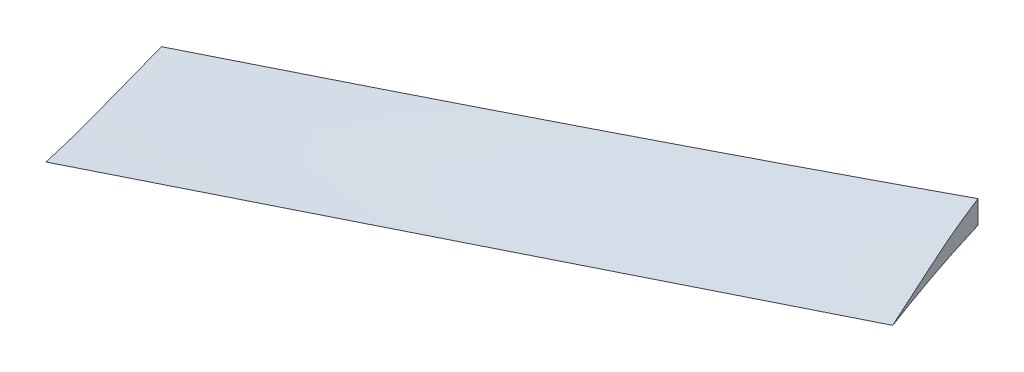
ISO-10303-21;
HEADER;
FILE_DESCRIPTION(('STEP AP214'),'2;1');
FILE_NAME('part.step','',(''),(''),'','','');
FILE_SCHEMA(('AUTOMOTIVE_DESIGN { 1 0 10303 214 1 1 1 1 }'));
ENDSEC;
DATA;
#1=APPLICATION_CONTEXT('core data for automotive mechanical design processes');
#2=APPLICATION_PROTOCOL_DEFINITION('international standard','automotive_design',2000,#1);
#3=PRODUCT_CONTEXT('',#1,'mechanical');
#4=PRODUCT('Part','Part','',(#3));
#5=PRODUCT_RELATED_PRODUCT_CATEGORY('part','',(#4));
#6=PRODUCT_DEFINITION_FORMATION('','',#4);
#7=PRODUCT_DEFINITION_CONTEXT('part definition',#1,'design');
#8=PRODUCT_DEFINITION('design','',#6,#7);
#9=PRODUCT_DEFINITION_SHAPE('','',#8);
#10=(LENGTH_UNIT() NAMED_UNIT(*) SI_UNIT(.MILLI.,.METRE.));
#11=(NAMED_UNIT(*) PLANE_ANGLE_UNIT() SI_UNIT($,.RADIAN.));
#12=(NAMED_UNIT(*) SI_UNIT($,.STERADIAN.) SOLID_ANGLE_UNIT());
#13=UNCERTAINTY_MEASURE_WITH_UNIT(LENGTH_MEASURE(1.E-05),#10,'distance_accuracy_value','');
#14=(GEOMETRIC_REPRESENTATION_CONTEXT(3) GLOBAL_UNCERTAINTY_ASSIGNED_CONTEXT((#13)) GLOBAL_UNIT_ASSIGNED_CONTEXT((#10,
#11,#12)) REPRESENTATION_CONTEXT('',''));
#15=CARTESIAN_POINT('',(0.,0.,0.));
#16=DIRECTION('',(0.,0.,1.));
#17=DIRECTION('',(1.,0.,0.));
#18=AXIS2_PLACEMENT_3D('',#15,#16,#17);
#19=CARTESIAN_POINT('',(374.396,61.9718742803303,500.462069913375));
#20=DIRECTION('',(1.,0.,0.));
#21=DIRECTION('',(0.,0.,1.));
#22=AXIS2_PLACEMENT_3D('',#19,#20,#21);
#23=PLANE('',#22);
#24=DIRECTION('',(0.,1.,0.));
#25=VECTOR('',#24,1.);
#26=CARTESIAN_POINT('',(374.396,61.9718742803303,762.947336932218));
#27=LINE('',#26,#25);
#28=CARTESIAN_POINT('',(374.396,-2.40388597600074,762.947336932218));
#29=VERTEX_POINT('',#28);
#30=CARTESIAN_POINT('',(374.396,1.23163319584544,762.94733693398));
#31=VERTEX_POINT('',#30);
#32=EDGE_CURVE('E85',#29,#31,#27,.T.);
#33=ORIENTED_EDGE('',*,*,#32,.T.);
#34=CARTESIAN_POINT('',(374.396,-9.34014397229245,776.396489798407));
#35=CARTESIAN_POINT('',(374.396,-8.40175484291137,775.264229702307));
#36=CARTESIAN_POINT('',(374.396,-6.09606028875458,772.482179211869));
#37=CARTESIAN_POINT('',(374.396,-2.17943506157781,768.02376491039));
#38=CARTESIAN_POINT('',(374.396,1.84859835881143,762.218322929233));
#39=CARTESIAN_POINT('',(374.396,5.6003449114185,755.243229685749));
#40=CARTESIAN_POINT('',(374.396,9.33547168888237,746.912760700583));
#41=CARTESIAN_POINT('',(374.396,13.2386089066728,737.018252871707));
#42=CARTESIAN_POINT('',(374.396,17.3161821827427,725.47867829808));
#43=CARTESIAN_POINT('',(374.396,21.5115819527909,712.428375502739));
#44=CARTESIAN_POINT('',(374.396,25.7421233345226,698.167711363482));
#45=CARTESIAN_POINT('',(374.396,29.9240395368495,683.062552056113));
#46=CARTESIAN_POINT('',(374.396,33.9819197101395,667.44471749513));
#47=CARTESIAN_POINT('',(374.396,37.8587807196238,651.563094478592));
#48=CARTESIAN_POINT('',(374.396,41.5075682698668,635.571677798897));
#49=CARTESIAN_POINT('',(374.396,44.8962045562709,619.54213496093));
#50=CARTESIAN_POINT('',(374.396,48.0062629675248,603.480438344816));
#51=CARTESIAN_POINT('',(374.396,50.8384531277133,587.348007896632));
#52=CARTESIAN_POINT('',(374.396,53.4037267628393,571.079262558276));
#53=CARTESIAN_POINT('',(374.396,55.7297505453312,554.597347914761));
#54=CARTESIAN_POINT('',(374.396,57.8518789503547,537.831743695071));
#55=CARTESIAN_POINT('',(374.396,59.8203943308259,520.741731840539));
#56=CARTESIAN_POINT('',(374.396,61.6856473828784,503.340217598354));
#57=CARTESIAN_POINT('',(374.396,63.4899259876005,485.710728793018));
#58=CARTESIAN_POINT('',(374.396,65.2498913593578,468.011203683683));
#59=CARTESIAN_POINT('',(374.396,66.9517721977821,450.459510763352));
#60=CARTESIAN_POINT('',(374.396,68.5378660271085,433.311455418955));
#61=CARTESIAN_POINT('',(374.396,69.9289151057664,416.841536857024));
#62=CARTESIAN_POINT('',(374.396,71.0327683067303,401.296477173787));
#63=CARTESIAN_POINT('',(374.396,71.7296272901284,386.808729152987));
#64=CARTESIAN_POINT('',(374.396,71.8938086245965,373.351309186629));
#65=CARTESIAN_POINT('',(374.396,71.4602978508936,360.783321416241));
#66=CARTESIAN_POINT('',(374.396,70.4184719929158,348.941977505793));
#67=CARTESIAN_POINT('',(374.396,68.7634225939546,337.701052477739));
#68=CARTESIAN_POINT('',(374.396,66.4985267442778,326.980618986022));
#69=CARTESIAN_POINT('',(374.396,63.6364757752088,316.739864214787));
#70=CARTESIAN_POINT('',(374.396,60.2063348553058,306.973125092115));
#71=CARTESIAN_POINT('',(374.396,56.2453758331957,297.713837697883));
#72=CARTESIAN_POINT('',(374.396,51.8366046907402,289.029736201877));
#73=CARTESIAN_POINT('',(374.396,47.1113365011114,281.025296442116));
#74=CARTESIAN_POINT('',(374.396,42.2563698958084,273.817045833498));
#75=CARTESIAN_POINT('',(374.396,37.4675939077021,267.502444449423));
#76=CARTESIAN_POINT('',(374.396,32.9120113189413,262.11107633905));
#77=CARTESIAN_POINT('',(374.396,28.6710997916291,257.609906739654));
#78=CARTESIAN_POINT('',(374.396,24.7595382100328,253.911291370847));
#79=CARTESIAN_POINT('',(374.396,21.1572388306981,250.902182399076));
#80=CARTESIAN_POINT('',(374.396,17.8395196406259,248.463647547404));
#81=CARTESIAN_POINT('',(374.396,14.7801988216139,246.49190181607));
#82=CARTESIAN_POINT('',(374.396,11.9506148597635,244.907396988431));
#83=CARTESIAN_POINT('',(374.396,9.32321496425856,243.64953423366));
#84=CARTESIAN_POINT('',(374.396,6.87061839463228,242.679778651959));
#85=CARTESIAN_POINT('',(374.396,4.57158692532996,241.966757378294));
#86=CARTESIAN_POINT('',(374.396,2.40963479027394,241.495055010141));
#87=CARTESIAN_POINT('',(374.396,0.894237049815755,241.32398184574));
#88=CARTESIAN_POINT('',(374.396,0.107544091622905,241.302884141123));
#89=CARTESIAN_POINT('',(374.396,0.,241.3));
#90=B_SPLINE_CURVE_WITH_KNOTS('',3,(#34,#35,#36,#37,#38,#39,#40,#41,#42,#43,#44,#45,#46,#47,#48,
#49,#50,#51,#52,#53,#54,#55,#56,#57,#58,#59,#60,#61,#62,#63,#64,#65,#66,#67,#68,#69,#70,#71,#72,
#73,#74,#75,#76,#77,#78,#79,#80,#81,#82,#83,#84,#85,#86,#87,#88,#89),.UNSPECIFIED.,.F.,.F.,(4,1,
1,1,1,1,1,1,1,1,1,1,1,1,1,1,1,1,1,1,1,1,1,1,1,1,1,1,1,1,1,1,1,1,1,1,1,1,1,1,1,1,1,1,1,1,1,1,1,1,
1,1,1,4),(0.,0.00766402095757611,0.0188310913155853,0.0309061878624514,0.044388540676871,
0.0600474083532868,0.0784606788934647,0.0998047207561698,0.123816969987705,0.149890658407643,
0.177317925985823,0.205492409209094,0.233979752311192,0.262509715956203,0.290967606389999,
0.319357501013423,0.347763187640679,0.376320625595132,0.405182950986283,0.434503841432051,
0.464386678217646,0.494832433453987,0.525708038913636,0.556739737234784,0.587525557609377,
0.617604809699268,0.646485108208642,0.67366014348048,0.698815639347954,0.722062593959947,
0.743776305511465,0.764323117717657,0.783977995344401,0.802952239366703,0.821385981311945,
0.839352413735504,0.856858699994966,0.873830573178779,0.890070807540379,0.905268010379337,
0.919095859386137,0.931350851483357,0.942034396352869,0.951307872005367,0.959388407782576,
0.966479389489374,0.972752010348399,0.978344065778329,0.983368996467432,0.987921251922054,
0.992076472154305,0.995898893569495,0.99943936225551,1.),.UNSPECIFIED.);
#91=CARTESIAN_POINT('',(374.396,-9.34014397229244,776.396489798407));
#92=VERTEX_POINT('',#91);
#93=EDGE_CURVE('E77',#92,#31,#90,.T.);
#94=ORIENTED_EDGE('',*,*,#93,.F.);
#95=CARTESIAN_POINT('',(374.396,0.,241.3));
#96=CARTESIAN_POINT('',(374.396,-0.538954659703314,241.297655184968));
#97=CARTESIAN_POINT('',(374.396,-1.7261603333214,241.292490042168));
#98=CARTESIAN_POINT('',(374.396,-3.55475690139812,241.690170496209));
#99=CARTESIAN_POINT('',(374.396,-5.28575044275841,242.787647348631));
#100=CARTESIAN_POINT('',(374.396,-6.47819703634325,244.55910096819));
#101=CARTESIAN_POINT('',(374.396,-7.23439961710996,246.693492664323));
#102=CARTESIAN_POINT('',(374.396,-7.74934951346128,249.131026639712));
#103=CARTESIAN_POINT('',(374.396,-8.1095524567562,251.905250666347));
#104=CARTESIAN_POINT('',(374.396,-8.36536130938982,255.097825264003));
#105=CARTESIAN_POINT('',(374.396,-8.53927775370538,258.834169307143));
#106=CARTESIAN_POINT('',(374.396,-8.6228222097704,263.297687326147));
#107=CARTESIAN_POINT('',(374.396,-8.59845411935391,268.75143324473));
#108=CARTESIAN_POINT('',(374.396,-8.43043441446886,275.5550068996));
#109=CARTESIAN_POINT('',(374.396,-8.06897383873518,284.115477039142));
#110=CARTESIAN_POINT('',(374.396,-7.46729611245012,294.701993416563));
#111=CARTESIAN_POINT('',(374.396,-6.56550935140482,307.23866248115));
#112=CARTESIAN_POINT('',(374.396,-5.26774660320282,321.351176792217));
#113=CARTESIAN_POINT('',(374.396,-3.4986121172012,336.635216144863));
#114=CARTESIAN_POINT('',(374.396,-1.31741885957216,352.842840734093));
#115=CARTESIAN_POINT('',(374.396,1.12162569591117,369.80872672652));
#116=CARTESIAN_POINT('',(374.396,3.70484150758706,387.306924798737));
#117=CARTESIAN_POINT('',(374.396,6.35085572360206,405.053096077913));
#118=CARTESIAN_POINT('',(374.396,8.98235684046696,422.799408725511));
#119=CARTESIAN_POINT('',(374.396,11.5300227909959,440.376908078112));
#120=CARTESIAN_POINT('',(374.396,13.9430010682351,457.707871031536));
#121=CARTESIAN_POINT('',(374.396,16.1729066622707,474.772580756103));
#122=CARTESIAN_POINT('',(374.396,18.1852831627042,491.576454148917));
#123=CARTESIAN_POINT('',(374.396,19.9445194919549,508.13688707812));
#124=CARTESIAN_POINT('',(374.396,21.4228531653779,524.480515326682));
#125=CARTESIAN_POINT('',(374.396,22.6006648317829,540.633952092378));
#126=CARTESIAN_POINT('',(374.396,23.4570220295475,556.625916689834));
#127=CARTESIAN_POINT('',(374.396,23.9811859014682,572.479352868524));
#128=CARTESIAN_POINT('',(374.396,24.1589041565962,588.217968124516));
#129=CARTESIAN_POINT('',(374.396,23.9828437048313,603.859249005849));
#130=CARTESIAN_POINT('',(374.396,23.4456129995817,619.418444987461));
#131=CARTESIAN_POINT('',(374.396,22.5455229148943,634.89794778659));
#132=CARTESIAN_POINT('',(374.396,21.2803649513233,650.289014071176));
#133=CARTESIAN_POINT('',(374.396,19.6554964574737,665.556610194271));
#134=CARTESIAN_POINT('',(374.396,17.6770159172737,680.627419737525));
#135=CARTESIAN_POINT('',(374.396,15.374920464339,695.363311814011));
#136=CARTESIAN_POINT('',(374.396,12.7828970747854,709.538692080346));
#137=CARTESIAN_POINT('',(374.396,9.97075851827043,722.850908635221));
#138=CARTESIAN_POINT('',(374.396,7.01255821457496,734.983994696583));
#139=CARTESIAN_POINT('',(374.396,3.96652793492765,745.710637795198));
#140=CARTESIAN_POINT('',(374.396,0.871097223163982,754.965559992787));
#141=CARTESIAN_POINT('',(374.396,-2.26764612386533,762.812999366146));
#142=CARTESIAN_POINT('',(374.396,-5.55090807095211,769.870558630561));
#143=CARTESIAN_POINT('',(374.396,-8.0522393298167,774.178423342215));
#144=CARTESIAN_POINT('',(374.396,-9.34014397229244,776.396489798407));
#145=B_SPLINE_CURVE_WITH_KNOTS('',3,(#95,#96,#97,#98,#99,#100,#101,#102,#103,#104,#105,#106,
#107,#108,#109,#110,#111,#112,#113,#114,#115,#116,#117,#118,#119,#120,#121,#122,#123,#124,#125,
#126,#127,#128,#129,#130,#131,#132,#133,#134,#135,#136,#137,#138,#139,#140,#141,#142,#143,#144),
.UNSPECIFIED.,.F.,.F.,(4,1,1,1,1,1,1,1,1,1,1,1,1,1,1,1,1,1,1,1,1,1,1,1,1,1,1,1,1,1,1,1,1,1,1,1,
1,1,1,1,1,1,1,1,1,1,1,4),(0.,0.00295699573707231,0.00651365017947627,0.0101253848931793,
0.0139115751929899,0.0180004278100691,0.0225091316382041,0.0275701977614678,0.0333552559313343,
0.0400939348988516,0.0481089397634267,0.0578698759413965,0.0700431416558855,0.0854823200575231,
0.104922628293272,0.128274621706956,0.154506379577485,0.182746709372674,0.212765692945345,
0.244315984766029,0.276878379293871,0.309904596254752,0.342852711105616,0.375404074373811,
0.407445978793529,0.438949076096661,0.469916219615646,0.500387507784893,0.530404994878598,
0.560035323702218,0.589330242489587,0.618350497736926,0.64714111982614,0.675762770521893,
0.704247976592449,0.732632991406434,0.76090944583605,0.789050397380166,0.816945539223071,
0.844377954813452,0.870950736544431,0.89607601673736,0.91908997684288,0.939522087621465,
0.957298390503345,0.972656028240629,0.985920925887869,1.),.UNSPECIFIED.);
#146=EDGE_CURVE('E49',#29,#92,#145,.T.);
#147=ORIENTED_EDGE('',*,*,#146,.F.);
#148=EDGE_LOOP('',(#33,#94,#147));
#149=FACE_BOUND('',#148,.T.);
#150=ADVANCED_FACE('F37',(#149),#23,.T.);
#151=CARTESIAN_POINT('',(266.7,66.8514364736246,396.625549586027));
#152=DIRECTION('',(1.,0.,0.));
#153=DIRECTION('',(0.,0.,1.));
#154=AXIS2_PLACEMENT_3D('',#151,#152,#153);
#155=PLANE('',#154);
#156=CARTESIAN_POINT('',(266.7,0.,-2.22044604925031E-13));
#157=CARTESIAN_POINT('',(266.7,-0.519005663251776,0.017452032873233));
#158=CARTESIAN_POINT('',(266.7,-1.83376590691603,0.0616620302726911));
#159=CARTESIAN_POINT('',(266.7,-4.39681155696864,0.570189514822628));
#160=CARTESIAN_POINT('',(266.7,-10.6163864618155,2.53612961981586));
#161=CARTESIAN_POINT('',(266.7,-20.5501355548249,7.99821180015903));
#162=CARTESIAN_POINT('',(266.7,-34.1849518234197,16.113653600363));
#163=CARTESIAN_POINT('',(266.7,-48.9001609581499,25.7512677237677));
#164=CARTESIAN_POINT('',(266.7,-62.9387722637982,36.9320129206593));
#165=CARTESIAN_POINT('',(266.7,-75.9185649305428,49.3363693895977));
#166=CARTESIAN_POINT('',(266.7,-85.6249870081858,65.2269065389885));
#167=CARTESIAN_POINT('',(266.7,-91.7173571850375,84.4527650461813));
#168=CARTESIAN_POINT('',(266.7,-96.1515107337435,106.852134497504));
#169=CARTESIAN_POINT('',(266.7,-98.572249175019,132.510932075947));
#170=CARTESIAN_POINT('',(266.7,-99.0923828679342,161.194365788217));
#171=CARTESIAN_POINT('',(266.7,-97.704243710744,192.761343292207));
#172=CARTESIAN_POINT('',(266.7,-94.5118392960195,227.038217577403));
#173=CARTESIAN_POINT('',(266.7,-89.6638281224946,263.834756502374));
#174=CARTESIAN_POINT('',(266.7,-83.3884450275636,302.921473177158));
#175=CARTESIAN_POINT('',(266.7,-75.9777868038037,344.017776041357));
#176=CARTESIAN_POINT('',(266.7,-67.7807073824362,386.776799789028));
#177=CARTESIAN_POINT('',(266.7,-59.2023239554158,430.774614869882));
#178=CARTESIAN_POINT('',(266.7,-50.6638051201837,475.496263681297));
#179=CARTESIAN_POINT('',(266.7,-42.6036124709931,520.335279967129));
#180=CARTESIAN_POINT('',(266.7,-35.422796347196,564.588870456406));
#181=CARTESIAN_POINT('',(266.7,-29.4733080838114,607.47093439981));
#182=CARTESIAN_POINT('',(266.7,-25.0144733830484,648.127538759038));
#183=CARTESIAN_POINT('',(266.7,-22.1862417822715,685.667615873134));
#184=CARTESIAN_POINT('',(266.7,-21.0047614095253,719.196759596281));
#185=CARTESIAN_POINT('',(266.7,-21.2786363122994,747.830287498173));
#186=CARTESIAN_POINT('',(266.7,-22.8547119223245,770.688405742853));
#187=CARTESIAN_POINT('',(266.7,-25.0735156397646,787.091395164078));
#188=CARTESIAN_POINT('',(266.7,-26.8193281874778,796.842303094878));
#189=CARTESIAN_POINT('',(266.7,-27.7751407453036,801.097715574997));
#190=CARTESIAN_POINT('',(266.7,-28.0117320332951,802.151053398607));
#191=B_SPLINE_CURVE_WITH_KNOTS('',3,(#156,#157,#158,#159,#160,#161,#162,#163,#164,#165,#166,
#167,#168,#169,#170,#171,#172,#173,#174,#175,#176,#177,#178,#179,#180,#181,#182,#183,#184,#185,
#186,#187,#188,#189,#190),.UNSPECIFIED.,.F.,.F.,(4,1,1,1,1,1,1,1,1,1,1,1,1,1,1,1,1,1,1,1,1,1,1,
1,1,1,1,1,1,1,1,1,4),(0.,0.00182090933464196,0.00461278049497482,0.00913453013845994,
0.0246759391487866,0.0441527676320363,0.064937102928184,0.0863209881898911,0.107137618403306,
0.127599776801144,0.150892792929449,0.177565203441126,0.207667777211646,0.241222088418686,
0.278203414074027,0.318526302563412,0.362030578586225,0.408464624639153,0.457479061609077,
0.508614437318857,0.56129601455956,0.61483529472868,0.668437533813961,0.721214466101836,
0.772202341152847,0.82039348306447,0.86476592329606,0.904323703961063,0.938131580580512,
0.965241743376092,0.984690446789536,0.996210442222917,1.),.UNSPECIFIED.);
#192=CARTESIAN_POINT('',(266.7,-24.7019448750279,783.964772228695));
#193=VERTEX_POINT('',#192);
#194=CARTESIAN_POINT('',(266.7,-28.0117320332951,802.151053398607));
#195=VERTEX_POINT('',#194);
#196=EDGE_CURVE('E88',#193,#195,#191,.T.);
#197=ORIENTED_EDGE('',*,*,#196,.T.);
#198=CARTESIAN_POINT('',(266.7,-28.0117320332951,802.151053398607));
#199=CARTESIAN_POINT('',(266.7,-27.7105421234966,801.137231832083));
#200=CARTESIAN_POINT('',(266.7,-26.5641562509699,797.278434829008));
#201=CARTESIAN_POINT('',(266.7,-23.4586005929746,789.35722595566));
#202=CARTESIAN_POINT('',(266.7,-18.6435790763109,777.06146068027));
#203=CARTESIAN_POINT('',(266.7,-13.040064965801,760.58172221373));
#204=CARTESIAN_POINT('',(266.7,-7.12332820026992,739.996750309987));
#205=CARTESIAN_POINT('',(266.7,-0.379813283306496,715.577161880766));
#206=CARTESIAN_POINT('',(266.7,7.01302179788049,687.646997388513));
#207=CARTESIAN_POINT('',(266.7,14.9584437350902,656.683490082779));
#208=CARTESIAN_POINT('',(266.7,23.2583450492186,623.158916560123));
#209=CARTESIAN_POINT('',(266.7,31.6943761736925,587.549187867879));
#210=CARTESIAN_POINT('',(266.7,40.0261592775311,550.319226889966));
#211=CARTESIAN_POINT('',(266.7,48.0016259470944,511.914813654682));
#212=CARTESIAN_POINT('',(266.7,55.374538475184,472.761711336735));
#213=CARTESIAN_POINT('',(266.7,61.9127756173434,433.262164148353));
#214=CARTESIAN_POINT('',(266.7,67.4048011857756,393.795881301525));
#215=CARTESIAN_POINT('',(266.7,71.6551802592197,354.719946084274));
#216=CARTESIAN_POINT('',(266.7,74.5356984510162,316.356950184387));
#217=CARTESIAN_POINT('',(266.7,75.7535877143672,278.931254813949));
#218=CARTESIAN_POINT('',(266.7,75.3938232860087,242.699408929629));
#219=CARTESIAN_POINT('',(266.7,73.5466559514521,207.870582877245));
#220=CARTESIAN_POINT('',(266.7,70.2589806515456,174.746776105023));
#221=CARTESIAN_POINT('',(266.7,65.7681833795225,143.601377812806));
#222=CARTESIAN_POINT('',(266.7,60.1874606388896,114.762118238696));
#223=CARTESIAN_POINT('',(266.7,53.6284711641162,88.5344901534683));
#224=CARTESIAN_POINT('',(266.7,46.23822310474,65.1989800417861));
#225=CARTESIAN_POINT('',(266.7,38.1338729096921,45.0005898028449));
#226=CARTESIAN_POINT('',(266.7,29.5092329050107,28.1586169294015));
#227=CARTESIAN_POINT('',(266.7,20.5578270147687,14.8710331109794));
#228=CARTESIAN_POINT('',(266.7,12.3132643573259,6.14419143155653));
#229=CARTESIAN_POINT('',(266.7,6.17648660124204,1.9481025776692));
#230=CARTESIAN_POINT('',(266.7,3.0841226330873,0.639134364117389));
#231=CARTESIAN_POINT('',(266.7,1.66803034708105,0.217045478239974));
#232=CARTESIAN_POINT('',(266.7,0.777840261453222,0.042563088957337));
#233=CARTESIAN_POINT('',(266.7,0.196310087295787,0.0107420046178697));
#234=CARTESIAN_POINT('',(266.7,0.,0.));
#235=B_SPLINE_CURVE_WITH_KNOTS('',3,(#198,#199,#200,#201,#202,#203,#204,#205,#206,#207,#208,
#209,#210,#211,#212,#213,#214,#215,#216,#217,#218,#219,#220,#221,#222,#223,#224,#225,#226,#227,
#228,#229,#230,#231,#232,#233,#234),.UNSPECIFIED.,.F.,.F.,(4,1,1,1,1,1,1,1,1,1,1,1,1,1,1,1,1,1,
1,1,1,1,1,1,1,1,1,1,1,1,1,1,1,1,4),(0.,0.0038023449945569,0.0144724456001439,0.0305636248499039,
0.0512990586437873,0.0770284704780323,0.1075738110133,0.142399412839652,0.180921149261364,
0.222524680037491,0.266590974271359,0.312514686460119,0.359710118436383,0.407632336843648,
0.455773216728113,0.503669018265595,0.550900956266296,0.59709618330248,0.64197604819215,
0.685511898484932,0.727353251544964,0.767353583197193,0.805169064220494,0.840471251936796,
0.872937278412314,0.902335208905147,0.928425322985344,0.95111304623239,0.970252676129248,
0.985871491026606,0.993981783732224,0.996752649298779,0.997906779196307,0.999293380847839,1.),.UNSPECIFIED.);
#236=CARTESIAN_POINT('',(266.7,-21.3623541395567,783.964772228696));
#237=VERTEX_POINT('',#236);
#238=EDGE_CURVE('E74',#195,#237,#235,.T.);
#239=ORIENTED_EDGE('',*,*,#238,.T.);
#240=DIRECTION('',(0.,1.,0.));
#241=VECTOR('',#240,1.);
#242=CARTESIAN_POINT('',(266.7,66.8514364736246,783.964772228695));
#243=LINE('',#242,#241);
#244=EDGE_CURVE('E80',#193,#237,#243,.T.);
#245=ORIENTED_EDGE('',*,*,#244,.F.);
#246=EDGE_LOOP('',(#197,#239,#245));
#247=FACE_BOUND('',#246,.T.);
#248=ADVANCED_FACE('F87',(#247),#155,.F.);
#249=CARTESIAN_POINT('',(266.7,0.,-2.22044604925031E-13));
#250=CARTESIAN_POINT('',(374.396,0.,241.3));
#251=CARTESIAN_POINT('',(266.7,-0.519005663251776,0.017452032873233));
#252=CARTESIAN_POINT('',(374.396,-0.331886704636986,241.298556069755));
#253=CARTESIAN_POINT('',(266.7,-1.3618249649772,0.0457925910221828));
#254=CARTESIAN_POINT('',(374.396,-0.870841364341308,241.296211254686));
#255=CARTESIAN_POINT('',(266.7,-2.6634654039068,0.226280634755372));
#256=CARTESIAN_POINT('',(374.396,-1.70943421464947,241.344222492389));
#257=CARTESIAN_POINT('',(266.7,-3.97403038996995,0.509651519022748));
#258=CARTESIAN_POINT('',(374.396,-2.55920664922827,241.473659712357));
#259=CARTESIAN_POINT('',(266.7,-5.67385444121891,0.973848906397344));
#260=CARTESIAN_POINT('',(374.396,-3.64262077740679,241.803197439326));
#261=CARTESIAN_POINT('',(266.7,-7.16309300403349,1.47525432920108));
#262=CARTESIAN_POINT('',(374.396,-4.53090319650363,242.30906244344));
#263=CARTESIAN_POINT('',(266.7,-9.13382191892448,2.21755656123289));
#264=CARTESIAN_POINT('',(374.396,-5.55782495136222,243.191830962093));
#265=CARTESIAN_POINT('',(266.7,-11.453768061813,3.21073121014721));
#266=CARTESIAN_POINT('',(374.396,-6.47819703634325,244.55910096819));
#267=CARTESIAN_POINT('',(266.7,-14.617973091907,4.77970463040736));
#268=CARTESIAN_POINT('',(374.396,-7.23439961710996,246.693492664323));
#269=CARTESIAN_POINT('',(266.7,-17.3166062761094,6.25777311353042));
#270=CARTESIAN_POINT('',(374.396,-7.64023176274066,248.614513816651));
#271=CARTESIAN_POINT('',(266.7,-19.6956552854928,7.60639519180477));
#272=CARTESIAN_POINT('',(374.396,-7.90594773867192,250.337120501505));
#273=CARTESIAN_POINT('',(266.7,-22.3812018585213,9.14631621312915));
#274=CARTESIAN_POINT('',(374.396,-8.14107334072312,252.298641170282));
#275=CARTESIAN_POINT('',(266.7,-26.1735562664804,11.3644547961668));
#276=CARTESIAN_POINT('',(374.396,-8.36536130938982,255.097825264003));
#277=CARTESIAN_POINT('',(266.7,-30.2167539485569,13.7991824723));
#278=CARTESIAN_POINT('',(374.396,-8.50577797119065,258.114474781775));
#279=CARTESIAN_POINT('',(266.7,-33.7898551936557,16.006465809378));
#280=CARTESIAN_POINT('',(374.396,-8.57607507063383,260.800134433941));
#281=CARTESIAN_POINT('',(266.7,-38.0749689864005,18.7045105812848));
#282=CARTESIAN_POINT('',(374.396,-8.61951975158411,264.03680013913));
#283=CARTESIAN_POINT('',(266.7,-43.0326466847677,21.9489678007733));
#284=CARTESIAN_POINT('',(374.396,-8.60260863384226,267.821624382103));
#285=CARTESIAN_POINT('',(266.7,-48.1556543500042,25.5292516620161));
#286=CARTESIAN_POINT('',(374.396,-8.52279965656649,271.814887678518));
#287=CARTESIAN_POINT('',(266.7,-54.4787814064188,30.2051721674396));
#288=CARTESIAN_POINT('',(374.396,-8.37614377666767,276.840771973178));
#289=CARTESIAN_POINT('',(266.7,-59.21097416833,34.0450840120657));
#290=CARTESIAN_POINT('',(374.396,-8.21187216466257,280.731216253276));
#291=CARTESIAN_POINT('',(266.7,-66.7177473674311,40.5837955754244));
#292=CARTESIAN_POINT('',(374.396,-7.90078272144247,287.074798848759));
#293=CARTESIAN_POINT('',(266.7,-71.2212759750493,44.8473264489632));
#294=CARTESIAN_POINT('',(374.396,-7.67586937060329,291.011671029708));
#295=CARTESIAN_POINT('',(266.7,-78.7147601260786,53.9140647830376));
#296=CARTESIAN_POINT('',(374.396,-7.19227953762016,298.512563555816));
#297=CARTESIAN_POINT('',(266.7,-82.225027577047,59.6607791632406));
#298=CARTESIAN_POINT('',(374.396,-6.88444295994953,302.753693364615));
#299=CARTESIAN_POINT('',(266.7,-87.4534530628719,70.9970466703564));
#300=CARTESIAN_POINT('',(374.396,-6.24053273005785,310.695056733583));
#301=CARTESIAN_POINT('',(266.7,-89.7697096736798,78.3446750738636));
#302=CARTESIAN_POINT('',(374.396,-5.79892956830818,315.574830378182));
#303=CARTESIAN_POINT('',(266.7,-93.2074407087006,91.9800035581626));
#304=CARTESIAN_POINT('',(374.396,-4.88972790908421,324.504044619292));
#305=CARTESIAN_POINT('',(266.7,-94.9135603303454,100.900000700637));
#306=CARTESIAN_POINT('',(374.396,-4.23566514532944,330.267612338575));
#307=CARTESIAN_POINT('',(266.7,-97.005165128164,115.900507892542));
#308=CARTESIAN_POINT('',(374.396,-3.05208518184974,339.875237406886));
#309=CARTESIAN_POINT('',(266.7,-97.8865275960693,125.902245338752));
#310=CARTESIAN_POINT('',(374.396,-2.20748872519501,346.22906719993));
#311=CARTESIAN_POINT('',(266.7,-98.75417769385,142.543611522293));
#312=CARTESIAN_POINT('',(374.396,-0.74886429526847,356.776450878177));
#313=CARTESIAN_POINT('',(266.7,-98.8967324071274,152.988210306159));
#314=CARTESIAN_POINT('',(374.396,0.197735976323111,363.382190722137));
#315=CARTESIAN_POINT('',(266.7,-98.6388148142237,171.252474350066));
#316=CARTESIAN_POINT('',(374.396,1.8783669007804,374.934743465949));
#317=CARTESIAN_POINT('',(266.7,-98.167165219046,181.781622659568));
#318=CARTESIAN_POINT('',(374.396,2.86181165787558,381.59640567588));
#319=CARTESIAN_POINT('',(266.7,-96.9252639056158,200.427096468206));
#320=CARTESIAN_POINT('',(374.396,4.61482322733841,393.409950006193));
#321=CARTESIAN_POINT('',(266.7,-95.8892856649466,212.248563796527));
#322=CARTESIAN_POINT('',(374.396,5.73307738434339,400.910635156407));
#323=CARTESIAN_POINT('',(266.7,-93.9170501098702,230.560974680308));
#324=CARTESIAN_POINT('',(374.396,7.46322094477587,412.554662718623));
#325=CARTESIAN_POINT('',(266.7,-92.1057468529205,245.300525783924));
#326=CARTESIAN_POINT('',(374.396,8.85139442738161,421.944119431141));
#327=CARTESIAN_POINT('',(266.7,-89.8666738732242,261.34924066548));
#328=CARTESIAN_POINT('',(374.396,10.3438260637576,432.1928005028));
#329=CARTESIAN_POINT('',(266.7,-87.1381441062203,279.547204739609));
#330=CARTESIAN_POINT('',(374.396,12.0115787545206,443.835633190795));
#331=CARTESIAN_POINT('',(266.7,-85.0097430183189,292.603367172898));
#332=CARTESIAN_POINT('',(374.396,13.1775369513835,452.210005436779));
#333=CARTESIAN_POINT('',(266.7,-81.9768416077611,310.449999196815));
#334=CARTESIAN_POINT('',(374.396,14.7230268076779,463.677142940125));
#335=CARTESIAN_POINT('',(266.7,-79.4997720108798,324.486370546341));
#336=CARTESIAN_POINT('',(374.396,15.9019157810272,472.711102593387));
#337=CARTESIAN_POINT('',(266.7,-76.3354462343199,341.704088509269));
#338=CARTESIAN_POINT('',(374.396,17.256226478449,483.818586327657));
#339=CARTESIAN_POINT('',(266.7,-73.11330510943,358.907075437163));
#340=CARTESIAN_POINT('',(374.396,18.5417239937417,494.931781899646));
#341=CARTESIAN_POINT('',(266.7,-70.3759298068697,373.214643626466));
#342=CARTESIAN_POINT('',(374.396,19.5253586437092,504.19114937449));
#343=CARTESIAN_POINT('',(266.7,-67.1096041275571,390.133820811262));
#344=CARTESIAN_POINT('',(374.396,20.5793335961559,515.155035898326));
#345=CARTESIAN_POINT('',(266.7,-63.8734968884462,406.814797843799));
#346=CARTESIAN_POINT('',(374.396,21.5317971237121,525.974658568893));
#347=CARTESIAN_POINT('',(266.7,-61.0133621780533,421.54722005373));
#348=CARTESIAN_POINT('',(374.396,22.2294255076911,535.542483636339));
#349=CARTESIAN_POINT('',(266.7,-57.8321293832433,438.029181500437));
#350=CARTESIAN_POINT('',(374.396,22.9014618730221,546.251159079221));
#351=CARTESIAN_POINT('',(266.7,-54.8900972631222,453.360486195974));
#352=CARTESIAN_POINT('',(374.396,23.4306621830767,556.216150002343));
#353=CARTESIAN_POINT('',(266.7,-51.8871003453324,469.33391942981));
#354=CARTESIAN_POINT('',(374.396,23.7867838395826,566.599625466069));
#355=CARTESIAN_POINT('',(266.7,-48.8916261777276,485.52799842522));
#356=CARTESIAN_POINT('',(374.396,24.0336281183519,577.123602127611));
#357=CARTESIAN_POINT('',(266.7,-46.1649694476022,500.552592435812));
#358=CARTESIAN_POINT('',(374.396,24.1438423700701,586.884105922058));
#359=CARTESIAN_POINT('',(266.7,-43.3544640433365,516.664631646372));
#360=CARTESIAN_POINT('',(374.396,24.0562428641255,597.338438366863));
#361=CARTESIAN_POINT('',(266.7,-40.632213355911,532.703647959634));
#362=CARTESIAN_POINT('',(374.396,23.8490170930789,607.735115480837));
#363=CARTESIAN_POINT('',(266.7,-38.2057415102212,547.541695853908));
#364=CARTESIAN_POINT('',(374.396,23.5173669837782,617.340316742621));
#365=CARTESIAN_POINT('',(266.7,-35.7378428697099,563.553708719992));
#366=CARTESIAN_POINT('',(374.396,22.9651406808118,627.68147635491));
#367=CARTESIAN_POINT('',(266.7,-33.3794153776786,579.522261616508));
#368=CARTESIAN_POINT('',(374.396,22.2924017289982,637.977250974283));
#369=CARTESIAN_POINT('',(266.7,-31.3921839739352,593.911474256049));
#370=CARTESIAN_POINT('',(374.396,21.5317192441452,647.231205723815));
#371=CARTESIAN_POINT('',(266.7,-29.3660049958083,609.855513064526));
#372=CARTESIAN_POINT('',(374.396,20.5177858170183,657.454363315461));
#373=CARTESIAN_POINT('',(266.7,-27.4821776509517,625.707993003144));
#374=CARTESIAN_POINT('',(374.396,19.3878173782554,667.595619595499));
#375=CARTESIAN_POINT('',(266.7,-26.0551277469561,639.363004579966));
#376=CARTESIAN_POINT('',(374.396,18.245527457778,676.296859504056));
#377=CARTESIAN_POINT('',(266.7,-24.5948079611536,655.05729262507));
#378=CARTESIAN_POINT('',(374.396,16.7960088815145,686.266814307816));
#379=CARTESIAN_POINT('',(266.7,-23.4694594123956,668.635033118669));
#380=CARTESIAN_POINT('',(374.396,15.437659586113,694.868483727388));
#381=CARTESIAN_POINT('',(266.7,-22.5515055669474,683.009336930279));
#382=CARTESIAN_POINT('',(374.396,13.808500572683,703.929823100315));
#383=CARTESIAN_POINT('',(266.7,-21.7989659011648,697.718534363653));
#384=CARTESIAN_POINT('',(374.396,12.0154999317075,713.171428073591));
#385=CARTESIAN_POINT('',(266.7,-21.3983991838216,708.982115212396));
#386=CARTESIAN_POINT('',(374.396,10.5265566907603,720.219848506321));
#387=CARTESIAN_POINT('',(266.7,-21.1774878669688,722.695229287603));
#388=CARTESIAN_POINT('',(374.396,8.53103302363648,728.755956143095));
#389=CARTESIAN_POINT('',(266.7,-21.1528367859848,734.677989823989));
#390=CARTESIAN_POINT('',(374.396,6.66393929910598,736.183474334445));
#391=CARTESIAN_POINT('',(266.7,-21.3928438290913,744.704050604341));
#392=CARTESIAN_POINT('',(374.396,4.92014472235172,742.352461417276));
#393=CARTESIAN_POINT('',(266.7,-21.8697638410092,755.58036736302));
#394=CARTESIAN_POINT('',(374.396,2.86616747391412,749.000567825704));
#395=CARTESIAN_POINT('',(266.7,-22.355437153206,763.291834582696));
#396=CARTESIAN_POINT('',(374.396,1.29954778983049,753.684550327495));
#397=CARTESIAN_POINT('',(266.7,-23.2588301525727,772.688644260209));
#398=CARTESIAN_POINT('',(374.396,-0.868760958720117,759.315527508768));
#399=CARTESIAN_POINT('',(266.7,-24.1736594816359,780.439012654354));
#400=CARTESIAN_POINT('',(374.396,-2.7920044138194,763.919051463631));
#401=CARTESIAN_POINT('',(266.7,-25.0232012596895,786.269991852081));
#402=CARTESIAN_POINT('',(374.396,-4.37377975950631,767.340254026866));
#403=CARTESIAN_POINT('',(266.7,-26.1121746466343,792.892629873239));
#404=CARTESIAN_POINT('',(374.396,-6.33607102631374,771.153076086345));
#405=CARTESIAN_POINT('',(266.7,-26.8961499835263,797.184324579084));
#406=CARTESIAN_POINT('',(374.396,-7.70558378875242,773.581403188584));
#407=CARTESIAN_POINT('',(266.7,-27.7751407453036,801.097715574997));
#408=CARTESIAN_POINT('',(374.396,-8.99348843122743,775.799469644794));
#409=CARTESIAN_POINT('',(266.7,-28.0117320332951,802.151053398607));
#410=CARTESIAN_POINT('',(374.396,-9.34014397229244,776.396489798407));
#411=B_SPLINE_SURFACE_WITH_KNOTS('',3,1,((#249,#250),(#251,#252),(#253,#254),(#255,#256),(#257,
#258),(#259,#260),(#261,#262),(#263,#264),(#265,#266),(#267,#268),(#269,#270),(#271,#272),(#273,
#274),(#275,#276),(#277,#278),(#279,#280),(#281,#282),(#283,#284),(#285,#286),(#287,#288),(#289,
#290),(#291,#292),(#293,#294),(#295,#296),(#297,#298),(#299,#300),(#301,#302),(#303,#304),(#305,
#306),(#307,#308),(#309,#310),(#311,#312),(#313,#314),(#315,#316),(#317,#318),(#319,#320),(#321,
#322),(#323,#324),(#325,#326),(#327,#328),(#329,#330),(#331,#332),(#333,#334),(#335,#336),(#337,
#338),(#339,#340),(#341,#342),(#343,#344),(#345,#346),(#347,#348),(#349,#350),(#351,#352),(#353,
#354),(#355,#356),(#357,#358),(#359,#360),(#361,#362),(#363,#364),(#365,#366),(#367,#368),(#369,
#370),(#371,#372),(#373,#374),(#375,#376),(#377,#378),(#379,#380),(#381,#382),(#383,#384),(#385,
#386),(#387,#388),(#389,#390),(#391,#392),(#393,#394),(#395,#396),(#397,#398),(#399,#400),(#401,
#402),(#403,#404),(#405,#406),(#407,#408),(#409,#410)),.UNSPECIFIED.,.F.,.F.,.F.,(4,1,1,1,1,1,1,
1,1,1,1,1,1,1,1,1,1,1,1,1,1,1,1,1,1,1,1,1,1,1,1,1,1,1,1,1,1,1,1,1,1,1,1,1,1,1,1,1,1,1,1,1,1,1,1,
1,1,1,1,1,1,1,1,1,1,1,1,1,1,1,1,1,1,1,1,1,1,1,4),(2,2),(0.,0.00182090933464196,
0.00295699573707231,0.00461278049497482,0.00651365017947627,0.00913453013845995,
0.0101253848931793,0.0139115751929899,0.0180004278100691,0.0225091316382041,0.0246759391487866,
0.0275701977614678,0.0333552559313344,0.0400939348988516,0.0441527676320363,0.0481089397634267,
0.0578698759413965,0.064937102928184,0.0700431416558856,0.0854823200575231,0.0863209881898911,
0.104922628293272,0.107137618403306,0.127599776801144,0.128274621706956,0.150892792929449,
0.154506379577485,0.177565203441126,0.182746709372674,0.207667777211646,0.212765692945345,
0.241222088418686,0.244315984766029,0.276878379293871,0.278203414074027,0.309904596254752,
0.318526302563412,0.342852711105616,0.362030578586225,0.375404074373811,0.407445978793529,
0.408464624639154,0.438949076096661,0.457479061609077,0.469916219615646,0.500387507784893,
0.508614437318857,0.530404994878599,0.560035323702218,0.56129601455956,0.589330242489588,
0.61483529472868,0.618350497736926,0.64714111982614,0.668437533813961,0.675762770521893,
0.704247976592449,0.721214466101836,0.732632991406434,0.760909445836051,0.772202341152847,
0.789050397380166,0.816945539223072,0.820393483064471,0.844377954813452,0.86476592329606,
0.870950736544432,0.89607601673736,0.904323703961064,0.91908997684288,0.938131580580512,
0.939522087621465,0.957298390503346,0.965241743376092,0.972656028240629,0.984690446789537,
0.985920925887869,0.996210442222917,1.),(0.,1.),.UNSPECIFIED.);
#412=CARTESIAN_POINT('',(266.700000000762,-24.7019448752378,783.964772224492));
#413=CARTESIAN_POINT('',(269.475316325585,-24.1510441496775,783.423154792011));
#414=CARTESIAN_POINT('',(272.250430777704,-23.5990876466872,782.881576754564));
#415=CARTESIAN_POINT('',(277.800211495016,-22.492837937757,781.798508144332));
#416=CARTESIAN_POINT('',(280.574877760125,-21.938544731382,781.257017571562));
#417=CARTESIAN_POINT('',(288.898177633625,-20.2718143186026,779.632682251861));
#418=CARTESIAN_POINT('',(294.446070734612,-19.1555345662749,778.549982019178));
#419=CARTESIAN_POINT('',(305.539424996532,-16.9104608931824,776.385056159306));
#420=CARTESIAN_POINT('',(311.084886155359,-15.7816669616097,775.30283053253));
#421=CARTESIAN_POINT('',(319.400760751007,-14.0768110721102,773.67994429488));
#422=CARTESIAN_POINT('',(322.172326578732,-13.5065828953645,773.139058788886));
#423=CARTESIAN_POINT('',(327.71458965579,-12.3617539328633,772.057457284487));
#424=CARTESIAN_POINT('',(330.485286904746,-11.7871531452158,771.516741286157));
#425=CARTESIAN_POINT('',(336.687705752692,-10.4951346712768,770.306306944877));
#426=CARTESIAN_POINT('',(340.119163735558,-9.77640222621986,769.636640047987));
#427=CARTESIAN_POINT('',(346.980292385933,-8.33014801204157,768.297655058108));
#428=CARTESIAN_POINT('',(350.409963055149,-7.6026262513338,767.628336964785));
#429=CARTESIAN_POINT('',(357.26722892354,-6.13724798065453,766.290105816928));
#430=CARTESIAN_POINT('',(360.694824093489,-5.39939132853336,765.621192768097));
#431=CARTESIAN_POINT('',(365.834300411787,-4.28341637308469,764.618197197439));
#432=CARTESIAN_POINT('',(367.547142951516,-3.90989235752712,764.283927055077));
#433=CARTESIAN_POINT('',(370.972119942933,-3.1594838213916,763.615524957422));
#434=CARTESIAN_POINT('',(372.684254394113,-2.78259929841264,763.281393002228));
#435=CARTESIAN_POINT('',(374.396,-2.40388598018615,762.947336932218));
#436=B_SPLINE_CURVE_WITH_KNOTS('',3,(#412,#413,#414,#415,#416,#417,#418,#419,#420,#421,#422,
#423,#424,#425,#426,#427,#428,#429,#430,#431,#432,#433,#434,#435),.UNSPECIFIED.,.F.,.F.,(4,2,2,
2,2,2,2,2,2,2,2,4),(0.,8.6425106813521,17.28502297152,34.5701770477732,51.8553460533612,
60.4978919956126,69.1404416775915,79.8483449397754,90.5562379525888,101.264278390376,
106.618318457297,111.972362349868),.UNSPECIFIED.);
#437=EDGE_CURVE('E82',#193,#29,#436,.T.);
#438=DIRECTION('',(0.959038255411471,0.166271423634914,-0.229345674342773));
#439=VECTOR('',#438,1.);
#440=CARTESIAN_POINT('',(320.548,-18.6759380027938,789.273771598507));
#441=LINE('',#440,#439);
#442=EDGE_CURVE('E61',#195,#92,#441,.T.);
#443=ORIENTED_EDGE('',*,*,#437,.T.);
#444=ORIENTED_EDGE('',*,*,#146,.T.);
#445=ORIENTED_EDGE('',*,*,#442,.F.);
#446=ORIENTED_EDGE('',*,*,#196,.F.);
#447=EDGE_LOOP('',(#443,#444,#445,#446));
#448=FACE_BOUND('',#447,.T.);
#449=ADVANCED_FACE('F113',(#448),#411,.F.);
#450=CARTESIAN_POINT('',(266.7,-28.0117320332951,802.151053398607));
#451=CARTESIAN_POINT('',(374.396,-9.34014397229245,776.396489798407));
#452=CARTESIAN_POINT('',(266.7,-27.7105421234966,801.137231832083));
#453=CARTESIAN_POINT('',(374.396,-8.87458167427686,775.834742442447));
#454=CARTESIAN_POINT('',(266.7,-27.1034626018139,799.09376924672));
#455=CARTESIAN_POINT('',(374.396,-7.93619254489844,774.702482346318));
#456=CARTESIAN_POINT('',(266.7,-25.7854186580083,795.292141936303));
#457=CARTESIAN_POINT('',(374.396,-6.15165115025565,772.574536999169));
#458=CARTESIAN_POINT('',(266.7,-24.2588614555977,791.397764664238));
#459=CARTESIAN_POINT('',(374.396,-4.26202155875214,770.394436824221));
#460=CARTESIAN_POINT('',(266.7,-21.9350480912447,785.466642314201));
#461=CARTESIAN_POINT('',(374.396,-1.47437211635964,766.998287755283));
#462=CARTESIAN_POINT('',(266.7,-20.2920141482097,781.203462540436));
#463=CARTESIAN_POINT('',(374.396,0.33224842664788,764.403776880471));
#464=CARTESIAN_POINT('',(266.7,-17.8356825894506,774.535202210992));
#465=CARTESIAN_POINT('',(374.396,2.91656113191565,760.23281036368));
#466=CARTESIAN_POINT('',(266.7,-15.9344306987397,769.089736159502));
#467=CARTESIAN_POINT('',(374.396,4.80401973676515,756.723724774491));
#468=CARTESIAN_POINT('',(266.7,-13.4345877891217,761.37929477166));
#469=CARTESIAN_POINT('',(374.396,7.20208548467063,751.67086093825));
#470=CARTESIAN_POINT('',(266.7,-10.774808971337,752.700649783319));
#471=CARTESIAN_POINT('',(374.396,9.71206587243948,745.930763972223));
#472=CARTESIAN_POINT('',(266.7,-8.69982135689636,745.437130982028));
#473=CARTESIAN_POINT('',(374.396,11.6344054048237,741.084931346604));
#474=CARTESIAN_POINT('',(266.7,-5.69912100144089,734.795540398898));
#475=CARTESIAN_POINT('',(374.396,14.3244172977685,733.945403886932));
#476=CARTESIAN_POINT('',(266.7,-3.4282102468413,726.610436395963));
#477=CARTESIAN_POINT('',(374.396,16.2775570259211,728.417998241519));
#478=CARTESIAN_POINT('',(266.7,-0.116072715406888,714.440205616446));
#479=CARTESIAN_POINT('',(374.396,19.0261256635006,720.159690499558));
#480=CARTESIAN_POINT('',(266.7,2.94958070885903,702.998696266493));
#481=CARTESIAN_POINT('',(374.396,21.5004412504757,712.369178602079));
#482=CARTESIAN_POINT('',(266.7,5.94167833584036,691.617442978737));
#483=CARTESIAN_POINT('',(374.396,23.8363291615717,704.591922396227));
#484=CARTESIAN_POINT('',(266.7,9.68580646543027,677.218178433149));
#485=CARTESIAN_POINT('',(374.396,26.6935748306171,694.731050816878));
#486=CARTESIAN_POINT('',(266.7,12.3440700188311,666.840759606047));
#487=CARTESIAN_POINT('',(374.396,28.6659508009141,687.606792031207));
#488=CARTESIAN_POINT('',(266.7,16.1318134654308,651.849665596334));
#489=CARTESIAN_POINT('',(374.396,31.4214752655207,677.29927111203));
#490=CARTESIAN_POINT('',(266.7,19.1750397537093,639.652012491484));
#491=CARTESIAN_POINT('',(374.396,33.5951096127607,668.901047903331));
#492=CARTESIAN_POINT('',(266.7,22.6795582784775,625.31917705324));
#493=CARTESIAN_POINT('',(374.396,36.0391637498433,659.017184444122));
#494=CARTESIAN_POINT('',(266.7,26.3938893172621,609.904426782531));
#495=CARTESIAN_POINT('',(374.396,38.5858587469431,648.376554420172));
#496=CARTESIAN_POINT('',(266.7,29.2059004157878,597.976970509936));
#497=CARTESIAN_POINT('',(374.396,40.4669722288527,640.132262556974));
#498=CARTESIAN_POINT('',(266.7,32.7737966348588,582.536075620699));
#499=CARTESIAN_POINT('',(374.396,42.8019051639399,629.448970332903));
#500=CARTESIAN_POINT('',(266.7,35.8511702475867,568.974858791429));
#501=CARTESIAN_POINT('',(374.396,44.7750754921323,620.058276435237));
#502=CARTESIAN_POINT('',(266.7,38.9980462339525,554.642319505003));
#503=CARTESIAN_POINT('',(374.396,46.7203927804852,610.121232214539));
#504=CARTESIAN_POINT('',(266.7,42.3127099750924,539.199684690981));
#505=CARTESIAN_POINT('',(374.396,48.7212397629997,599.407861020313));
#506=CARTESIAN_POINT('',(266.7,44.9902605820588,526.350886167281));
#507=CARTESIAN_POINT('',(374.396,50.2872820576228,590.487531887032));
#508=CARTESIAN_POINT('',(266.7,48.104093776497,510.818929901063));
#509=CARTESIAN_POINT('',(374.396,52.0445697937626,579.698919464263));
#510=CARTESIAN_POINT('',(266.7,51.1552919972226,495.145017840208));
#511=CARTESIAN_POINT('',(374.396,53.7240937873423,568.809181748182));
#512=CARTESIAN_POINT('',(266.7,53.578186123049,482.040041291186));
#513=CARTESIAN_POINT('',(374.396,55.0091684882222,559.703302569358));
#514=CARTESIAN_POINT('',(266.7,56.4060468916524,466.108686475137));
#515=CARTESIAN_POINT('',(374.396,56.4842691126069,548.636370414338));
#516=CARTESIAN_POINT('',(266.7,58.7714739774059,452.2397554565));
#517=CARTESIAN_POINT('',(374.396,57.6988659774881,539.004695574003));
#518=CARTESIAN_POINT('',(266.7,61.2366190772906,436.650151880842));
#519=CARTESIAN_POINT('',(374.396,58.9627355161,528.187647405243));
#520=CARTESIAN_POINT('',(266.7,63.7240400863842,420.058295165139));
#521=CARTESIAN_POINT('',(374.396,60.2553827226073,516.683592551374));
#522=CARTESIAN_POINT('',(266.7,65.5564638030238,406.864708040788));
#523=CARTESIAN_POINT('',(374.396,61.2349186701313,507.545203139378));
#524=CARTESIAN_POINT('',(266.7,67.6992161228096,389.94653577574));
#525=CARTESIAN_POINT('',(374.396,62.4530966308646,495.841520949939));
#526=CARTESIAN_POINT('',(266.7,69.5081359227092,374.45883618145));
#527=CARTESIAN_POINT('',(374.396,63.5440936823509,485.138028986631));
#528=CARTESIAN_POINT('',(266.7,70.9884867564247,359.773781867722));
#529=CARTESIAN_POINT('',(374.396,64.5544996492868,475.004581639145));
#530=CARTESIAN_POINT('',(266.7,72.5229211676819,342.650465580585));
#531=CARTESIAN_POINT('',(374.396,65.7164512062377,463.199518296254));
#532=CARTESIAN_POINT('',(266.7,73.4956050743349,329.839119189284));
#533=CARTESIAN_POINT('',(374.396,66.5719630054818,454.376526667794));
#534=CARTESIAN_POINT('',(266.7,74.474925042496,312.940649554788));
#535=CARTESIAN_POINT('',(374.396,67.6650024110726,442.748421454093));
#536=CARTESIAN_POINT('',(266.7,75.1391999612293,297.811369435371));
#537=CARTESIAN_POINT('',(374.396,68.6138542328138,432.343109025925));
#538=CARTESIAN_POINT('',(266.7,75.4507550618579,284.078369929798));
#539=CARTESIAN_POINT('',(374.396,69.4172259728448,422.899898475993));
#540=CARTESIAN_POINT('',(266.7,75.588132064545,268.489379477277));
#541=CARTESIAN_POINT('',(374.396,70.2601796641781,412.17648961437));
#542=CARTESIAN_POINT('',(266.7,75.5096360990851,256.380880507946));
#543=CARTESIAN_POINT('',(374.396,70.851938028306,403.843027265944));
#544=CARTESIAN_POINT('',(266.7,75.1326240073552,241.831890658776));
#545=CARTESIAN_POINT('',(374.396,71.3926131616745,393.81527694646));
#546=CARTESIAN_POINT('',(266.7,74.6131914764262,228.380193432762));
#547=CARTESIAN_POINT('',(374.396,71.7573789082441,384.534017591296));
#548=CARTESIAN_POINT('',(266.7,73.9422069874904,216.762129126993));
#549=CARTESIAN_POINT('',(374.396,71.8553530269403,376.50339178721));
#550=CARTESIAN_POINT('',(266.7,73.0239360177708,204.291890973869));
#551=CARTESIAN_POINT('',(374.396,71.7049544257928,367.876203595418));
#552=CARTESIAN_POINT('',(266.7,72.0179347481979,192.581425982553));
#553=CARTESIAN_POINT('',(374.396,71.3712740578708,359.771481153951));
#554=CARTESIAN_POINT('',(266.7,70.8346386488702,181.519187761647));
#555=CARTESIAN_POINT('',(374.396,70.6982043706662,352.121402610732));
#556=CARTESIAN_POINT('',(266.7,69.4965857469974,170.418855135549));
#557=CARTESIAN_POINT('',(374.396,69.7590559647993,344.463291770487));
#558=CARTESIAN_POINT('',(266.7,68.0916004408085,159.767243698315));
#559=CARTESIAN_POINT('',(374.396,68.6431396594004,337.131717159181));
#560=CARTESIAN_POINT('',(266.7,66.4912196714231,149.37216257581));
#561=CARTESIAN_POINT('',(374.396,67.1421963027516,330.027300665996));
#562=CARTESIAN_POINT('',(266.7,64.7665150659016,139.112380384402));
#563=CARTESIAN_POINT('',(374.396,65.4032571057948,323.061615482135));
#564=CARTESIAN_POINT('',(266.7,62.9675467652249,129.149144188454));
#565=CARTESIAN_POINT('',(374.396,63.495416214729,316.338221261877));
#566=CARTESIAN_POINT('',(266.7,60.9856466551966,119.532324832504));
#567=CARTESIAN_POINT('',(374.396,61.249090315449,309.942192773523));
#568=CARTESIAN_POINT('',(266.7,58.8486265329535,109.900800541479));
#569=CARTESIAN_POINT('',(374.396,58.7648902338496,303.603549709378));
#570=CARTESIAN_POINT('',(266.7,56.6982640869431,100.809763255861));
#571=CARTESIAN_POINT('',(374.396,56.2159171048708,297.679828006672));
#572=CARTESIAN_POINT('',(266.7,54.3004231802346,91.8459739064668));
#573=CARTESIAN_POINT('',(374.396,53.3259619657131,291.96337220197));
#574=CARTESIAN_POINT('',(266.7,51.7626321781644,82.9637531856924));
#575=CARTESIAN_POINT('',(374.396,50.2671628927327,286.371156450536));
#576=CARTESIAN_POINT('',(266.7,49.3804441484665,75.1399086313886));
#577=CARTESIAN_POINT('',(374.396,47.3976093978424,281.510232759967));
#578=CARTESIAN_POINT('',(266.7,46.5482545614749,66.8664930216294));
#579=CARTESIAN_POINT('',(374.396,44.0540476569872,276.486088253267));
#580=CARTESIAN_POINT('',(266.7,43.7772340707305,59.2831416550923));
#581=CARTESIAN_POINT('',(374.396,40.8336129131553,271.940962417991));
#582=CARTESIAN_POINT('',(266.7,41.1255027865587,52.5256409854181));
#583=CARTESIAN_POINT('',(374.396,37.8069758289801,267.949962052074));
#584=CARTESIAN_POINT('',(266.7,38.2125471232862,45.8797372609266));
#585=CARTESIAN_POINT('',(374.396,34.5982596689124,264.106690599811));
#586=CARTESIAN_POINT('',(266.7,35.5163619206976,40.0949060011652));
#587=CARTESIAN_POINT('',(374.396,31.6837294916241,260.807416787323));
#588=CARTESIAN_POINT('',(266.7,32.6936379578696,34.4465081359584));
#589=CARTESIAN_POINT('',(374.396,28.6967498146873,257.637130864296));
#590=CARTESIAN_POINT('',(266.7,29.9721179744599,29.6058815785976));
#591=CARTESIAN_POINT('',(374.396,25.9140463265061,255.002947829253));
#592=CARTESIAN_POINT('',(266.7,27.4946226548506,25.4607678963847));
#593=CARTESIAN_POINT('',(374.396,23.4216767247147,252.793735450439));
#594=CARTESIAN_POINT('',(266.7,25.212759699466,21.8416238738293));
#595=CARTESIAN_POINT('',(374.396,21.1572388306981,250.902182399076));
#596=CARTESIAN_POINT('',(266.7,22.1565370171014,17.543852735526));
#597=CARTESIAN_POINT('',(374.396,18.2262028903158,248.74786104677));
#598=CARTESIAN_POINT('',(266.7,19.858556639615,14.6166334757609));
#599=CARTESIAN_POINT('',(374.396,16.086096871353,247.333558856132));
#600=CARTESIAN_POINT('',(266.7,17.7401803426679,12.0771270209109));
#601=CARTESIAN_POINT('',(374.396,14.1480448956214,246.13790951153));
#602=CARTESIAN_POINT('',(266.7,15.2766248985803,9.37321909434001));
#603=CARTESIAN_POINT('',(374.396,11.9506148597635,244.907396988431));
#604=CARTESIAN_POINT('',(266.7,12.6226100298086,6.85975967787996));
#605=CARTESIAN_POINT('',(374.396,9.67824534177352,243.81950435867));
#606=CARTESIAN_POINT('',(266.7,10.5729030039685,5.14954914895867));
#607=CARTESIAN_POINT('',(374.396,7.97882295920264,243.117962238884));
#608=CARTESIAN_POINT('',(266.7,8.64375598098661,3.67019591169481));
#609=CARTESIAN_POINT('',(374.396,6.41145151589138,242.537372705335));
#610=CARTESIAN_POINT('',(266.7,6.75505539929224,2.42193311605638));
#611=CARTESIAN_POINT('',(374.396,4.92334526860239,242.075851657904));
#612=CARTESIAN_POINT('',(266.7,4.79222884562339,1.38429054861897));
#613=CARTESIAN_POINT('',(374.396,3.43402361787375,241.718559789943));
#614=CARTESIAN_POINT('',(266.7,3.60003160651422,0.857513718635916));
#615=CARTESIAN_POINT('',(374.396,2.55200506878751,241.550485791948));
#616=CARTESIAN_POINT('',(266.7,2.57301375323543,0.486790212687009));
#617=CARTESIAN_POINT('',(374.396,1.80642649532143,241.438011442811));
#618=CARTESIAN_POINT('',(266.7,1.66803034708105,0.217045478239974));
#619=CARTESIAN_POINT('',(374.396,1.15889670074201,241.360931807152));
#620=CARTESIAN_POINT('',(266.7,0.931526822497009,0.0726865410205439));
#621=CARTESIAN_POINT('',(374.396,0.644415999337006,241.323219102248));
#622=CARTESIAN_POINT('',(266.7,0.352064207748464,0.0192648039899318));
#623=CARTESIAN_POINT('',(374.396,0.243091003303652,241.306519267985));
#624=CARTESIAN_POINT('',(266.7,0.15575412048431,0.00852279933518493));
#625=CARTESIAN_POINT('',(374.396,0.107544091622905,241.302884141123));
#626=CARTESIAN_POINT('',(266.7,0.,0.));
#627=CARTESIAN_POINT('',(374.396,0.,241.3));
#628=B_SPLINE_SURFACE_WITH_KNOTS('',3,1,((#450,#451),(#452,#453),(#454,#455),(#456,#457),(#458,
#459),(#460,#461),(#462,#463),(#464,#465),(#466,#467),(#468,#469),(#470,#471),(#472,#473),(#474,
#475),(#476,#477),(#478,#479),(#480,#481),(#482,#483),(#484,#485),(#486,#487),(#488,#489),(#490,
#491),(#492,#493),(#494,#495),(#496,#497),(#498,#499),(#500,#501),(#502,#503),(#504,#505),(#506,
#507),(#508,#509),(#510,#511),(#512,#513),(#514,#515),(#516,#517),(#518,#519),(#520,#521),(#522,
#523),(#524,#525),(#526,#527),(#528,#529),(#530,#531),(#532,#533),(#534,#535),(#536,#537),(#538,
#539),(#540,#541),(#542,#543),(#544,#545),(#546,#547),(#548,#549),(#550,#551),(#552,#553),(#554,
#555),(#556,#557),(#558,#559),(#560,#561),(#562,#563),(#564,#565),(#566,#567),(#568,#569),(#570,
#571),(#572,#573),(#574,#575),(#576,#577),(#578,#579),(#580,#581),(#582,#583),(#584,#585),(#586,
#587),(#588,#589),(#590,#591),(#592,#593),(#594,#595),(#596,#597),(#598,#599),(#600,#601),(#602,
#603),(#604,#605),(#606,#607),(#608,#609),(#610,#611),(#612,#613),(#614,#615),(#616,#617),(#618,
#619),(#620,#621),(#622,#623),(#624,#625),(#626,#627)),.UNSPECIFIED.,.F.,.F.,.F.,(4,1,1,1,1,1,1,
1,1,1,1,1,1,1,1,1,1,1,1,1,1,1,1,1,1,1,1,1,1,1,1,1,1,1,1,1,1,1,1,1,1,1,1,1,1,1,1,1,1,1,1,1,1,1,1,
1,1,1,1,1,1,1,1,1,1,1,1,1,1,1,1,1,1,1,1,1,1,1,1,1,1,1,1,1,1,1,4),(2,2),(0.,0.0038023449945569,
0.00766402095757611,0.0144724456001439,0.0188310913155853,0.0305636248499039,0.0309061878624514,
0.044388540676871,0.0512990586437873,0.0600474083532868,0.0770284704780323,0.0784606788934647,
0.0998047207561698,0.1075738110133,0.123816969987705,0.142399412839652,0.149890658407643,
0.177317925985823,0.180921149261364,0.205492409209094,0.222524680037491,0.233979752311192,
0.262509715956203,0.266590974271359,0.290967606389999,0.312514686460119,0.319357501013423,
0.347763187640679,0.359710118436383,0.376320625595132,0.405182950986283,0.407632336843648,
0.434503841432051,0.455773216728113,0.464386678217646,0.494832433453987,0.503669018265595,
0.525708038913636,0.550900956266296,0.556739737234784,0.587525557609377,0.59709618330248,
0.617604809699268,0.64197604819215,0.646485108208642,0.67366014348048,0.685511898484932,
0.698815639347954,0.722062593959947,0.727353251544964,0.743776305511465,0.764323117717658,
0.767353583197193,0.783977995344401,0.802952239366704,0.805169064220494,0.821385981311946,
0.839352413735505,0.840471251936796,0.856858699994966,0.872937278412314,0.873830573178779,
0.890070807540379,0.902335208905147,0.905268010379337,0.919095859386137,0.928425322985344,
0.931350851483357,0.942034396352869,0.95111304623239,0.951307872005367,0.959388407782577,
0.966479389489375,0.970252676129248,0.972752010348399,0.978344065778329,0.983368996467432,
0.985871491026606,0.987921251922054,0.992076472154306,0.993981783732224,0.995898893569495,
0.996752649298779,0.997906779196307,0.999293380847839,0.99943936225551,1.),(0.,1.),.UNSPECIFIED.);
#629=CARTESIAN_POINT('',(374.395999999984,1.23163319685293,762.947336932305));
#630=CARTESIAN_POINT('',(372.157729195418,0.735269599557903,763.384147137004));
#631=CARTESIAN_POINT('',(369.918984784502,0.241127305528356,763.82104976848));
#632=CARTESIAN_POINT('',(365.44061483035,-0.742989428077179,764.695026989019));
#633=CARTESIAN_POINT('',(363.200989287578,-1.23296386984661,765.132101577993));
#634=CARTESIAN_POINT('',(356.480899700757,-2.69704545870076,766.443562060077));
#635=CARTESIAN_POINT('',(351.999209554123,-3.66531378079026,767.318187233484));
#636=CARTESIAN_POINT('',(343.033075945151,-5.58824138358304,769.067974904204));
#637=CARTESIAN_POINT('',(338.548632515923,-6.54290082472473,769.943137395054));
#638=CARTESIAN_POINT('',(329.577325231024,-8.44034648704913,771.69393473558));
#639=CARTESIAN_POINT('',(325.090461374076,-9.38313270196364,772.569569585505));
#640=CARTESIAN_POINT('',(316.114198371081,-11.2584237468027,774.321334060226));
#641=CARTESIAN_POINT('',(311.624799016496,-12.1909275399368,775.19746372572));
#642=CARTESIAN_POINT('',(302.644184951186,-14.0468515225962,776.950077332913));
#643=CARTESIAN_POINT('',(298.152970237457,-14.9702716970307,777.826561275199));
#644=CARTESIAN_POINT('',(289.168909583807,-16.8091616699813,779.579847502057));
#645=CARTESIAN_POINT('',(284.676063622254,-17.7246313587354,780.456649790851));
#646=CARTESIAN_POINT('',(275.689008588085,-19.5485357111458,782.210520386663));
#647=CARTESIAN_POINT('',(271.194799519147,-20.4569703936112,783.087588692962));
#648=CARTESIAN_POINT('',(266.7,-21.3623541395567,783.964772228695));
#649=B_SPLINE_CURVE_WITH_KNOTS('',3,(#629,#630,#631,#632,#633,#634,#635,#636,#637,#638,#639,
#640,#641,#642,#643,#644,#645,#646,#647,#648),.UNSPECIFIED.,.F.,.F.,(4,2,2,2,2,2,2,2,2,4),(0.,
7.00166328011974,14.0033228751986,28.0066009510004,42.0097138019811,56.0128340452785,
70.0173535626945,84.0218963420913,98.0266321577443,112.031330516684),.UNSPECIFIED.);
#650=EDGE_CURVE('E11',#31,#237,#649,.T.);
#651=ORIENTED_EDGE('',*,*,#650,.T.);
#652=ORIENTED_EDGE('',*,*,#238,.F.);
#653=ORIENTED_EDGE('',*,*,#442,.T.);
#654=ORIENTED_EDGE('',*,*,#93,.T.);
#655=EDGE_LOOP('',(#651,#652,#653,#654));
#656=FACE_BOUND('',#655,.T.);
#657=ADVANCED_FACE('F72',(#656),#628,.F.);
#658=CARTESIAN_POINT('',(230.236248947807,-99.0923828679342,791.080863155065));
#659=DIRECTION('',(0.191541803323485,0.,0.981484456106966));
#660=DIRECTION('',(-0.981484456106966,0.,0.191541803323485));
#661=AXIS2_PLACEMENT_3D('',#658,#659,#660);
#662=PLANE('',#661);
#663=ORIENTED_EDGE('',*,*,#437,.F.);
#664=ORIENTED_EDGE('',*,*,#244,.T.);
#665=ORIENTED_EDGE('',*,*,#650,.F.);
#666=ORIENTED_EDGE('',*,*,#32,.F.);
#667=EDGE_LOOP('',(#663,#664,#665,#666));
#668=FACE_BOUND('',#667,.T.);
#669=ADVANCED_FACE('F81',(#668),#662,.F.);
#670=CLOSED_SHELL('',(#150,#248,#449,#657,#669));
#671=MANIFOLD_SOLID_BREP('B2',#670);
#672=ADVANCED_BREP_SHAPE_REPRESENTATION('',(#18,#671),#14);
#673=SHAPE_DEFINITION_REPRESENTATION(#9,#672);
ENDSEC;
END-ISO-10303-21;
